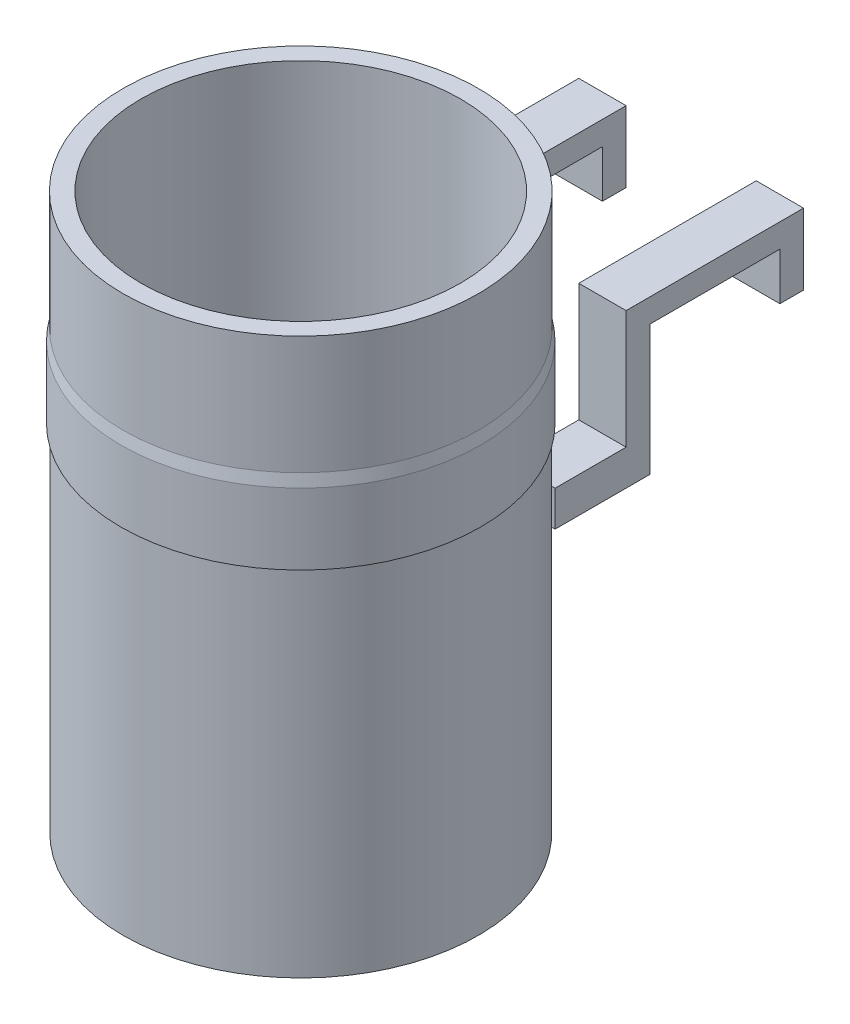
ISO-10303-21;
HEADER;
FILE_DESCRIPTION(('STEP AP214'),'2;1');
FILE_NAME('part.step','',(''),(''),'','','');
FILE_SCHEMA(('AUTOMOTIVE_DESIGN { 1 0 10303 214 1 1 1 1 }'));
ENDSEC;
DATA;
#1=APPLICATION_CONTEXT('core data for automotive mechanical design processes');
#2=APPLICATION_PROTOCOL_DEFINITION('international standard','automotive_design',2000,#1);
#3=PRODUCT_CONTEXT('',#1,'mechanical');
#4=PRODUCT('Part','Part','',(#3));
#5=PRODUCT_RELATED_PRODUCT_CATEGORY('part','',(#4));
#6=PRODUCT_DEFINITION_FORMATION('','',#4);
#7=PRODUCT_DEFINITION_CONTEXT('part definition',#1,'design');
#8=PRODUCT_DEFINITION('design','',#6,#7);
#9=PRODUCT_DEFINITION_SHAPE('','',#8);
#10=(LENGTH_UNIT() NAMED_UNIT(*) SI_UNIT(.MILLI.,.METRE.));
#11=(NAMED_UNIT(*) PLANE_ANGLE_UNIT() SI_UNIT($,.RADIAN.));
#12=(NAMED_UNIT(*) SI_UNIT($,.STERADIAN.) SOLID_ANGLE_UNIT());
#13=UNCERTAINTY_MEASURE_WITH_UNIT(LENGTH_MEASURE(1.E-05),#10,'distance_accuracy_value','');
#14=(GEOMETRIC_REPRESENTATION_CONTEXT(3) GLOBAL_UNCERTAINTY_ASSIGNED_CONTEXT((#13)) GLOBAL_UNIT_ASSIGNED_CONTEXT((#10,
#11,#12)) REPRESENTATION_CONTEXT('',''));
#15=CARTESIAN_POINT('',(0.,0.,0.));
#16=DIRECTION('',(0.,0.,1.));
#17=DIRECTION('',(1.,0.,0.));
#18=AXIS2_PLACEMENT_3D('',#15,#16,#17);
#19=CARTESIAN_POINT('',(-69.8748372027322,160.,-165.));
#20=DIRECTION('',(0.,1.,0.));
#21=DIRECTION('',(0.,0.,1.));
#22=AXIS2_PLACEMENT_3D('',#19,#20,#21);
#23=PLANE('',#22);
#24=DIRECTION('',(-1.,0.,0.));
#25=VECTOR('',#24,1.);
#26=CARTESIAN_POINT('',(-69.8748372027322,160.,-155.));
#27=LINE('',#26,#25);
#28=CARTESIAN_POINT('',(-69.8748372027322,160.,-155.));
#29=VERTEX_POINT('',#28);
#30=CARTESIAN_POINT('',(-89.8748372027322,160.,-155.));
#31=VERTEX_POINT('',#30);
#32=EDGE_CURVE('E214',#29,#31,#27,.T.);
#33=ORIENTED_EDGE('',*,*,#32,.F.);
#34=DIRECTION('',(0.,0.,1.));
#35=VECTOR('',#34,1.);
#36=CARTESIAN_POINT('',(-69.8748372027322,160.,-165.));
#37=LINE('',#36,#35);
#38=CARTESIAN_POINT('',(-69.8748372027323,160.,-100.));
#39=VERTEX_POINT('',#38);
#40=EDGE_CURVE('E57',#29,#39,#37,.T.);
#41=ORIENTED_EDGE('',*,*,#40,.T.);
#42=DIRECTION('',(-1.,0.,0.));
#43=VECTOR('',#42,1.);
#44=CARTESIAN_POINT('',(-69.8748372027322,160.,-100.));
#45=LINE('',#44,#43);
#46=CARTESIAN_POINT('',(-89.8748372027322,160.,-100.));
#47=VERTEX_POINT('',#46);
#48=EDGE_CURVE('E249',#39,#47,#45,.T.);
#49=ORIENTED_EDGE('',*,*,#48,.T.);
#50=DIRECTION('',(0.,0.,1.));
#51=VECTOR('',#50,1.);
#52=CARTESIAN_POINT('',(-89.8748372027322,160.,-165.));
#53=LINE('',#52,#51);
#54=EDGE_CURVE('E261',#31,#47,#53,.T.);
#55=ORIENTED_EDGE('',*,*,#54,.F.);
#56=EDGE_LOOP('',(#33,#41,#49,#55));
#57=FACE_BOUND('',#56,.T.);
#58=ADVANCED_FACE('F41',(#57),#23,.F.);
#59=CARTESIAN_POINT('',(5.1251627972678,160.,-165.));
#60=DIRECTION('',(0.,1.,0.));
#61=DIRECTION('',(0.,0.,1.));
#62=AXIS2_PLACEMENT_3D('',#59,#60,#61);
#63=PLANE('',#62);
#64=DIRECTION('',(-1.,0.,0.));
#65=VECTOR('',#64,1.);
#66=CARTESIAN_POINT('',(5.1251627972678,160.,-155.));
#67=LINE('',#66,#65);
#68=CARTESIAN_POINT('',(5.1251627972678,160.,-155.));
#69=VERTEX_POINT('',#68);
#70=CARTESIAN_POINT('',(-14.8748372027322,160.,-155.));
#71=VERTEX_POINT('',#70);
#72=EDGE_CURVE('E219',#69,#71,#67,.T.);
#73=ORIENTED_EDGE('',*,*,#72,.F.);
#74=DIRECTION('',(0.,0.,1.));
#75=VECTOR('',#74,1.);
#76=CARTESIAN_POINT('',(5.1251627972678,160.,-165.));
#77=LINE('',#76,#75);
#78=CARTESIAN_POINT('',(5.1251627972678,160.,-100.));
#79=VERTEX_POINT('',#78);
#80=EDGE_CURVE('E305',#69,#79,#77,.T.);
#81=ORIENTED_EDGE('',*,*,#80,.T.);
#82=DIRECTION('',(-1.,0.,0.));
#83=VECTOR('',#82,1.);
#84=CARTESIAN_POINT('',(5.1251627972678,160.,-100.));
#85=LINE('',#84,#83);
#86=CARTESIAN_POINT('',(-14.8748372027322,160.,-100.));
#87=VERTEX_POINT('',#86);
#88=EDGE_CURVE('E287',#79,#87,#85,.T.);
#89=ORIENTED_EDGE('',*,*,#88,.T.);
#90=DIRECTION('',(0.,0.,1.));
#91=VECTOR('',#90,1.);
#92=CARTESIAN_POINT('',(-14.8748372027322,160.,-165.));
#93=LINE('',#92,#91);
#94=EDGE_CURVE('E299',#71,#87,#93,.T.);
#95=ORIENTED_EDGE('',*,*,#94,.F.);
#96=EDGE_LOOP('',(#73,#81,#89,#95));
#97=FACE_BOUND('',#96,.T.);
#98=ADVANCED_FACE('F515',(#97),#63,.F.);
#99=CARTESIAN_POINT('',(0.,0.,-100.));
#100=DIRECTION('',(0.,0.,1.));
#101=DIRECTION('',(1.,0.,0.));
#102=AXIS2_PLACEMENT_3D('',#99,#100,#101);
#103=PLANE('',#102);
#104=ORIENTED_EDGE('',*,*,#48,.F.);
#105=DIRECTION('',(0.,1.,0.));
#106=VECTOR('',#105,1.);
#107=CARTESIAN_POINT('',(-69.8748372027323,120.,-100.));
#108=LINE('',#107,#106);
#109=CARTESIAN_POINT('',(-69.8748372027322,105.,-100.));
#110=VERTEX_POINT('',#109);
#111=EDGE_CURVE('E347',#110,#39,#108,.T.);
#112=ORIENTED_EDGE('',*,*,#111,.F.);
#113=DIRECTION('',(1.,0.,0.));
#114=VECTOR('',#113,1.);
#115=CARTESIAN_POINT('',(-89.8748372027323,105.,-100.));
#116=LINE('',#115,#114);
#117=CARTESIAN_POINT('',(-89.8748372027323,105.,-100.));
#118=VERTEX_POINT('',#117);
#119=EDGE_CURVE('E343',#118,#110,#116,.T.);
#120=ORIENTED_EDGE('',*,*,#119,.F.);
#121=DIRECTION('',(0.,-1.,0.));
#122=VECTOR('',#121,1.);
#123=CARTESIAN_POINT('',(-89.8748372027322,120.,-100.));
#124=LINE('',#123,#122);
#125=EDGE_CURVE('E340',#47,#118,#124,.T.);
#126=ORIENTED_EDGE('',*,*,#125,.F.);
#127=EDGE_LOOP('',(#104,#112,#120,#126));
#128=FACE_BOUND('',#127,.T.);
#129=ADVANCED_FACE('F459',(#128),#103,.F.);
#130=CARTESIAN_POINT('',(-89.8748372027322,120.,-100.));
#131=DIRECTION('',(0.,1.,0.));
#132=DIRECTION('',(0.,0.,1.));
#133=AXIS2_PLACEMENT_3D('',#130,#131,#132);
#134=PLANE('',#133);
#135=DIRECTION('',(0.,0.,1.));
#136=VECTOR('',#135,1.);
#137=CARTESIAN_POINT('',(-69.8748372027323,120.,-100.));
#138=LINE('',#137,#136);
#139=CARTESIAN_POINT('',(-69.8748372027323,120.,-90.));
#140=VERTEX_POINT('',#139);
#141=CARTESIAN_POINT('',(-69.8748372027323,120.,-69.7764286847643));
#142=VERTEX_POINT('',#141);
#143=EDGE_CURVE('E355',#140,#142,#138,.T.);
#144=ORIENTED_EDGE('',*,*,#143,.F.);
#145=DIRECTION('',(1.,0.,0.));
#146=VECTOR('',#145,1.);
#147=CARTESIAN_POINT('',(-69.8748372027323,120.,-90.));
#148=LINE('',#147,#146);
#149=CARTESIAN_POINT('',(-89.8748372027322,120.,-90.));
#150=VERTEX_POINT('',#149);
#151=EDGE_CURVE('E65',#150,#140,#148,.T.);
#152=ORIENTED_EDGE('',*,*,#151,.F.);
#153=DIRECTION('',(0.,0.,1.));
#154=VECTOR('',#153,1.);
#155=CARTESIAN_POINT('',(-89.8748372027322,120.,-100.));
#156=LINE('',#155,#154);
#157=CARTESIAN_POINT('',(-89.8748372027322,120.,-60.));
#158=VERTEX_POINT('',#157);
#159=EDGE_CURVE('E351',#150,#158,#156,.T.);
#160=ORIENTED_EDGE('',*,*,#159,.T.);
#161=DIRECTION('',(-1.,0.,0.));
#162=VECTOR('',#161,1.);
#163=CARTESIAN_POINT('',(-89.8748372027322,120.,-60.));
#164=LINE('',#163,#162);
#165=CARTESIAN_POINT('',(-87.3748372027322,120.,-60.));
#166=VERTEX_POINT('',#165);
#167=EDGE_CURVE('E336',#166,#158,#164,.T.);
#168=ORIENTED_EDGE('',*,*,#167,.F.);
#169=CARTESIAN_POINT('',(-42.3748372027322,120.,0.));
#170=DIRECTION('',(0.,1.,0.));
#171=DIRECTION('',(0.,0.,1.));
#172=AXIS2_PLACEMENT_3D('',#169,#170,#171);
#173=CIRCLE('',#172,75.);
#174=EDGE_CURVE('E11',#142,#166,#173,.T.);
#175=ORIENTED_EDGE('',*,*,#174,.F.);
#176=EDGE_LOOP('',(#144,#152,#160,#168,#175));
#177=FACE_BOUND('',#176,.T.);
#178=ADVANCED_FACE('F552',(#177),#134,.T.);
#179=CARTESIAN_POINT('',(0.,0.,-100.));
#180=DIRECTION('',(0.,0.,1.));
#181=DIRECTION('',(1.,0.,0.));
#182=AXIS2_PLACEMENT_3D('',#179,#180,#181);
#183=PLANE('',#182);
#184=ORIENTED_EDGE('',*,*,#88,.F.);
#185=DIRECTION('',(0.,1.,0.));
#186=VECTOR('',#185,1.);
#187=CARTESIAN_POINT('',(5.1251627972678,120.,-100.));
#188=LINE('',#187,#186);
#189=CARTESIAN_POINT('',(5.1251627972678,105.,-100.));
#190=VERTEX_POINT('',#189);
#191=EDGE_CURVE('E380',#190,#79,#188,.T.);
#192=ORIENTED_EDGE('',*,*,#191,.F.);
#193=DIRECTION('',(1.,0.,0.));
#194=VECTOR('',#193,1.);
#195=CARTESIAN_POINT('',(-14.8748372027322,105.,-100.));
#196=LINE('',#195,#194);
#197=CARTESIAN_POINT('',(-14.8748372027322,105.,-100.));
#198=VERTEX_POINT('',#197);
#199=EDGE_CURVE('E376',#198,#190,#196,.T.);
#200=ORIENTED_EDGE('',*,*,#199,.F.);
#201=DIRECTION('',(0.,-1.,0.));
#202=VECTOR('',#201,1.);
#203=CARTESIAN_POINT('',(-14.8748372027322,120.,-100.));
#204=LINE('',#203,#202);
#205=EDGE_CURVE('E373',#87,#198,#204,.T.);
#206=ORIENTED_EDGE('',*,*,#205,.F.);
#207=EDGE_LOOP('',(#184,#192,#200,#206));
#208=FACE_BOUND('',#207,.T.);
#209=ADVANCED_FACE('F555',(#208),#183,.F.);
#210=CARTESIAN_POINT('',(-14.8748372027322,120.,-100.));
#211=DIRECTION('',(0.,1.,0.));
#212=DIRECTION('',(0.,0.,1.));
#213=AXIS2_PLACEMENT_3D('',#210,#211,#212);
#214=PLANE('',#213);
#215=DIRECTION('',(0.,0.,1.));
#216=VECTOR('',#215,1.);
#217=CARTESIAN_POINT('',(5.1251627972678,120.,-100.));
#218=LINE('',#217,#216);
#219=CARTESIAN_POINT('',(5.1251627972678,120.,-90.));
#220=VERTEX_POINT('',#219);
#221=CARTESIAN_POINT('',(5.1251627972678,120.,-60.));
#222=VERTEX_POINT('',#221);
#223=EDGE_CURVE('E389',#220,#222,#218,.T.);
#224=ORIENTED_EDGE('',*,*,#223,.F.);
#225=DIRECTION('',(1.,0.,0.));
#226=VECTOR('',#225,1.);
#227=CARTESIAN_POINT('',(5.1251627972678,120.,-90.));
#228=LINE('',#227,#226);
#229=CARTESIAN_POINT('',(-14.8748372027322,120.,-90.));
#230=VERTEX_POINT('',#229);
#231=EDGE_CURVE('E308',#230,#220,#228,.T.);
#232=ORIENTED_EDGE('',*,*,#231,.F.);
#233=DIRECTION('',(0.,0.,1.));
#234=VECTOR('',#233,1.);
#235=CARTESIAN_POINT('',(-14.8748372027322,120.,-100.));
#236=LINE('',#235,#234);
#237=CARTESIAN_POINT('',(-14.8748372027322,120.,-69.7764286847643));
#238=VERTEX_POINT('',#237);
#239=EDGE_CURVE('E385',#230,#238,#236,.T.);
#240=ORIENTED_EDGE('',*,*,#239,.T.);
#241=CARTESIAN_POINT('',(-42.3748372027322,120.,0.));
#242=DIRECTION('',(0.,1.,0.));
#243=DIRECTION('',(0.,0.,1.));
#244=AXIS2_PLACEMENT_3D('',#241,#242,#243);
#245=CIRCLE('',#244,75.);
#246=CARTESIAN_POINT('',(2.62516279726781,120.,-60.));
#247=VERTEX_POINT('',#246);
#248=EDGE_CURVE('E430',#247,#238,#245,.T.);
#249=ORIENTED_EDGE('',*,*,#248,.F.);
#250=DIRECTION('',(-1.,0.,0.));
#251=VECTOR('',#250,1.);
#252=CARTESIAN_POINT('',(-14.8748372027322,120.,-60.));
#253=LINE('',#252,#251);
#254=EDGE_CURVE('E370',#222,#247,#253,.T.);
#255=ORIENTED_EDGE('',*,*,#254,.F.);
#256=EDGE_LOOP('',(#224,#232,#240,#249,#255));
#257=FACE_BOUND('',#256,.T.);
#258=ADVANCED_FACE('F570',(#257),#214,.T.);
#259=CARTESIAN_POINT('',(-42.3748372027322,150.,0.));
#260=DIRECTION('',(0.,-1.,0.));
#261=DIRECTION('',(0.,0.,-1.));
#262=AXIS2_PLACEMENT_3D('',#259,#260,#261);
#263=CYLINDRICAL_SURFACE('',#262,75.);
#264=DIRECTION('',(0.,-1.,0.));
#265=VECTOR('',#264,1.);
#266=CARTESIAN_POINT('',(-69.8748372027323,150.,-69.7764286847643));
#267=LINE('',#266,#265);
#268=CARTESIAN_POINT('',(-69.8748372027322,105.,-69.7764286847643));
#269=VERTEX_POINT('',#268);
#270=EDGE_CURVE('E50',#269,#142,#267,.F.);
#271=ORIENTED_EDGE('',*,*,#270,.T.);
#272=ORIENTED_EDGE('',*,*,#174,.T.);
#273=DIRECTION('',(0.,-1.,0.));
#274=VECTOR('',#273,1.);
#275=CARTESIAN_POINT('',(-87.3748372027322,150.,-60.));
#276=LINE('',#275,#274);
#277=CARTESIAN_POINT('',(-87.3748372027322,105.,-60.));
#278=VERTEX_POINT('',#277);
#279=EDGE_CURVE('E438',#166,#278,#276,.T.);
#280=ORIENTED_EDGE('',*,*,#279,.T.);
#281=CARTESIAN_POINT('',(-42.3748372027322,105.,0.));
#282=DIRECTION('',(0.,-1.,0.));
#283=DIRECTION('',(0.,0.,-1.));
#284=AXIS2_PLACEMENT_3D('',#281,#282,#283);
#285=CIRCLE('',#284,75.);
#286=EDGE_CURVE('E442',#278,#269,#285,.T.);
#287=ORIENTED_EDGE('',*,*,#286,.T.);
#288=EDGE_LOOP('',(#271,#272,#280,#287));
#289=FACE_BOUND('',#288,.T.);
#290=ORIENTED_EDGE('',*,*,#248,.T.);
#291=DIRECTION('',(0.,-1.,0.));
#292=VECTOR('',#291,1.);
#293=CARTESIAN_POINT('',(-14.8748372027322,150.,-69.7764286847643));
#294=LINE('',#293,#292);
#295=CARTESIAN_POINT('',(-14.8748372027322,105.,-69.7764286847643));
#296=VERTEX_POINT('',#295);
#297=EDGE_CURVE('E434',#238,#296,#294,.T.);
#298=ORIENTED_EDGE('',*,*,#297,.T.);
#299=CARTESIAN_POINT('',(-42.3748372027322,105.,0.));
#300=DIRECTION('',(0.,-1.,0.));
#301=DIRECTION('',(0.,0.,-1.));
#302=AXIS2_PLACEMENT_3D('',#299,#300,#301);
#303=CIRCLE('',#302,75.);
#304=CARTESIAN_POINT('',(2.62516279726781,105.,-60.));
#305=VERTEX_POINT('',#304);
#306=EDGE_CURVE('E426',#296,#305,#303,.T.);
#307=ORIENTED_EDGE('',*,*,#306,.T.);
#308=DIRECTION('',(0.,-1.,0.));
#309=VECTOR('',#308,1.);
#310=CARTESIAN_POINT('',(2.62516279726781,150.,-60.));
#311=LINE('',#310,#309);
#312=EDGE_CURVE('E419',#305,#247,#311,.F.);
#313=ORIENTED_EDGE('',*,*,#312,.T.);
#314=EDGE_LOOP('',(#290,#298,#307,#313));
#315=FACE_BOUND('',#314,.T.);
#316=CARTESIAN_POINT('',(-42.3748372027322,150.,0.));
#317=DIRECTION('',(0.,1.,0.));
#318=DIRECTION('',(0.,0.,1.));
#319=AXIS2_PLACEMENT_3D('',#316,#317,#318);
#320=CIRCLE('',#319,75.);
#321=CARTESIAN_POINT('',(-42.3748372027322,150.,75.));
#322=VERTEX_POINT('',#321);
#323=EDGE_CURVE('E415',#322,#322,#320,.T.);
#324=ORIENTED_EDGE('',*,*,#323,.F.);
#325=EDGE_LOOP('',(#324));
#326=FACE_BOUND('',#325,.T.);
#327=CARTESIAN_POINT('',(-42.3748372027322,0.,0.));
#328=DIRECTION('',(0.,1.,0.));
#329=DIRECTION('',(0.,0.,1.));
#330=AXIS2_PLACEMENT_3D('',#327,#328,#329);
#331=CIRCLE('',#330,75.);
#332=CARTESIAN_POINT('',(-42.3748372027322,0.,75.));
#333=VERTEX_POINT('',#332);
#334=EDGE_CURVE('E411',#333,#333,#331,.T.);
#335=ORIENTED_EDGE('',*,*,#334,.T.);
#336=EDGE_LOOP('',(#335));
#337=FACE_BOUND('',#336,.T.);
#338=ADVANCED_FACE('F43',(#289,#315,#326,#337),#263,.T.);
#339=CARTESIAN_POINT('',(-42.3748372027322,0.,0.));
#340=DIRECTION('',(0.,1.,0.));
#341=DIRECTION('',(0.,0.,1.));
#342=AXIS2_PLACEMENT_3D('',#339,#340,#341);
#343=PLANE('',#342);
#344=ORIENTED_EDGE('',*,*,#334,.F.);
#345=EDGE_LOOP('',(#344));
#346=FACE_BOUND('',#345,.T.);
#347=ADVANCED_FACE('F505',(#346),#343,.F.);
#348=CARTESIAN_POINT('',(-42.3748372027322,180.,0.));
#349=DIRECTION('',(0.,-1.,0.));
#350=DIRECTION('',(0.,0.,-1.));
#351=AXIS2_PLACEMENT_3D('',#348,#349,#350);
#352=CYLINDRICAL_SURFACE('',#351,76.);
#353=CARTESIAN_POINT('',(-42.3748372027322,180.,0.));
#354=DIRECTION('',(0.,1.,0.));
#355=DIRECTION('',(0.,0.,1.));
#356=AXIS2_PLACEMENT_3D('',#353,#354,#355);
#357=CIRCLE('',#356,76.);
#358=CARTESIAN_POINT('',(-42.3748372027322,180.,76.));
#359=VERTEX_POINT('',#358);
#360=EDGE_CURVE('E407',#359,#359,#357,.T.);
#361=ORIENTED_EDGE('',*,*,#360,.F.);
#362=EDGE_LOOP('',(#361));
#363=FACE_BOUND('',#362,.T.);
#364=CARTESIAN_POINT('',(-42.3748372027322,150.,0.));
#365=DIRECTION('',(0.,1.,0.));
#366=DIRECTION('',(0.,0.,1.));
#367=AXIS2_PLACEMENT_3D('',#364,#365,#366);
#368=CIRCLE('',#367,76.);
#369=CARTESIAN_POINT('',(-42.3748372027322,150.,76.));
#370=VERTEX_POINT('',#369);
#371=EDGE_CURVE('E406',#370,#370,#368,.T.);
#372=ORIENTED_EDGE('',*,*,#371,.T.);
#373=EDGE_LOOP('',(#372));
#374=FACE_BOUND('',#373,.T.);
#375=ADVANCED_FACE('F502',(#363,#374),#352,.T.);
#376=CARTESIAN_POINT('',(-42.3748372027322,150.,0.));
#377=DIRECTION('',(0.,1.,0.));
#378=DIRECTION('',(0.,0.,1.));
#379=AXIS2_PLACEMENT_3D('',#376,#377,#378);
#380=PLANE('',#379);
#381=ORIENTED_EDGE('',*,*,#323,.T.);
#382=EDGE_LOOP('',(#381));
#383=FACE_BOUND('',#382,.T.);
#384=ORIENTED_EDGE('',*,*,#371,.F.);
#385=EDGE_LOOP('',(#384));
#386=FACE_BOUND('',#385,.T.);
#387=ADVANCED_FACE('F498',(#383,#386),#380,.F.);
#388=CARTESIAN_POINT('',(-42.3748372027322,180.,0.));
#389=DIRECTION('',(0.,-1.,0.));
#390=DIRECTION('',(0.,0.,1.));
#391=AXIS2_PLACEMENT_3D('',#388,#389,#390);
#392=CONICAL_SURFACE('',#391,76.,0.174532925199433);
#393=CARTESIAN_POINT('',(-42.3748372027322,185.,0.));
#394=DIRECTION('',(0.,1.,0.));
#395=DIRECTION('',(0.,0.,1.));
#396=AXIS2_PLACEMENT_3D('',#393,#394,#395);
#397=CIRCLE('',#396,75.1183650964577);
#398=CARTESIAN_POINT('',(-42.3748372027322,185.,75.1183650964577));
#399=VERTEX_POINT('',#398);
#400=EDGE_CURVE('E402',#399,#399,#397,.T.);
#401=ORIENTED_EDGE('',*,*,#400,.F.);
#402=EDGE_LOOP('',(#401));
#403=FACE_BOUND('',#402,.T.);
#404=ORIENTED_EDGE('',*,*,#360,.T.);
#405=EDGE_LOOP('',(#404));
#406=FACE_BOUND('',#405,.T.);
#407=ADVANCED_FACE('F492',(#403,#406),#392,.T.);
#408=CARTESIAN_POINT('',(-42.3748372027322,235.,0.));
#409=DIRECTION('',(0.,-1.,0.));
#410=DIRECTION('',(0.,0.,-1.));
#411=AXIS2_PLACEMENT_3D('',#408,#409,#410);
#412=CYLINDRICAL_SURFACE('',#411,75.1183650964577);
#413=CARTESIAN_POINT('',(-42.3748372027322,235.,0.));
#414=DIRECTION('',(0.,1.,0.));
#415=DIRECTION('',(0.,0.,1.));
#416=AXIS2_PLACEMENT_3D('',#413,#414,#415);
#417=CIRCLE('',#416,75.1183650964577);
#418=CARTESIAN_POINT('',(-42.3748372027322,235.,75.1183650964577));
#419=VERTEX_POINT('',#418);
#420=EDGE_CURVE('E388',#419,#419,#417,.T.);
#421=ORIENTED_EDGE('',*,*,#420,.F.);
#422=EDGE_LOOP('',(#421));
#423=FACE_BOUND('',#422,.T.);
#424=ORIENTED_EDGE('',*,*,#400,.T.);
#425=EDGE_LOOP('',(#424));
#426=FACE_BOUND('',#425,.T.);
#427=ADVANCED_FACE('F486',(#423,#426),#412,.T.);
#428=CARTESIAN_POINT('',(-42.3748372027322,235.,0.));
#429=DIRECTION('',(0.,1.,0.));
#430=DIRECTION('',(0.,0.,1.));
#431=AXIS2_PLACEMENT_3D('',#428,#429,#430);
#432=PLANE('',#431);
#433=CARTESIAN_POINT('',(-42.3748372027322,235.,0.));
#434=DIRECTION('',(0.,1.,0.));
#435=DIRECTION('',(0.,0.,1.));
#436=AXIS2_PLACEMENT_3D('',#433,#434,#435);
#437=CIRCLE('',#436,67.5);
#438=CARTESIAN_POINT('',(-42.3748372027322,235.,67.5));
#439=VERTEX_POINT('',#438);
#440=EDGE_CURVE('E471',#439,#439,#437,.T.);
#441=ORIENTED_EDGE('',*,*,#440,.F.);
#442=EDGE_LOOP('',(#441));
#443=FACE_BOUND('',#442,.T.);
#444=ORIENTED_EDGE('',*,*,#420,.T.);
#445=EDGE_LOOP('',(#444));
#446=FACE_BOUND('',#445,.T.);
#447=ADVANCED_FACE('F482',(#443,#446),#432,.T.);
#448=CARTESIAN_POINT('',(-14.8748372027322,120.,-100.));
#449=DIRECTION('',(-1.,0.,0.));
#450=DIRECTION('',(0.,0.,1.));
#451=AXIS2_PLACEMENT_3D('',#448,#449,#450);
#452=PLANE('',#451);
#453=ORIENTED_EDGE('',*,*,#297,.F.);
#454=ORIENTED_EDGE('',*,*,#239,.F.);
#455=DIRECTION('',(0.,-1.,0.));
#456=VECTOR('',#455,1.);
#457=CARTESIAN_POINT('',(-14.8748372027322,170.,-90.));
#458=LINE('',#457,#456);
#459=CARTESIAN_POINT('',(-14.8748372027322,170.,-90.));
#460=VERTEX_POINT('',#459);
#461=EDGE_CURVE('E325',#460,#230,#458,.T.);
#462=ORIENTED_EDGE('',*,*,#461,.F.);
#463=DIRECTION('',(0.,0.,1.));
#464=VECTOR('',#463,1.);
#465=CARTESIAN_POINT('',(-14.8748372027322,170.,-100.));
#466=LINE('',#465,#464);
#467=CARTESIAN_POINT('',(-14.8748372027322,170.,-165.));
#468=VERTEX_POINT('',#467);
#469=EDGE_CURVE('E312',#468,#460,#466,.T.);
#470=ORIENTED_EDGE('',*,*,#469,.F.);
#471=DIRECTION('',(0.,1.,0.));
#472=VECTOR('',#471,1.);
#473=CARTESIAN_POINT('',(-14.8748372027322,170.,-165.));
#474=LINE('',#473,#472);
#475=CARTESIAN_POINT('',(-14.8748372027322,140.,-165.));
#476=VERTEX_POINT('',#475);
#477=EDGE_CURVE('E291',#476,#468,#474,.T.);
#478=ORIENTED_EDGE('',*,*,#477,.F.);
#479=DIRECTION('',(0.,0.,-1.));
#480=VECTOR('',#479,1.);
#481=CARTESIAN_POINT('',(-14.8748372027322,140.,-165.));
#482=LINE('',#481,#480);
#483=CARTESIAN_POINT('',(-14.8748372027322,140.,-155.));
#484=VERTEX_POINT('',#483);
#485=EDGE_CURVE('E234',#484,#476,#482,.T.);
#486=ORIENTED_EDGE('',*,*,#485,.F.);
#487=DIRECTION('',(0.,1.,0.));
#488=VECTOR('',#487,1.);
#489=CARTESIAN_POINT('',(-14.8748372027322,140.,-155.));
#490=LINE('',#489,#488);
#491=EDGE_CURVE('E241',#484,#71,#490,.T.);
#492=ORIENTED_EDGE('',*,*,#491,.T.);
#493=ORIENTED_EDGE('',*,*,#94,.T.);
#494=ORIENTED_EDGE('',*,*,#205,.T.);
#495=DIRECTION('',(0.,0.,1.));
#496=VECTOR('',#495,1.);
#497=CARTESIAN_POINT('',(-14.8748372027322,105.,-100.));
#498=LINE('',#497,#496);
#499=EDGE_CURVE('E384',#198,#296,#498,.T.);
#500=ORIENTED_EDGE('',*,*,#499,.T.);
#501=EDGE_LOOP('',(#453,#454,#462,#470,#478,#486,#492,#493,#494,#500));
#502=FACE_BOUND('',#501,.T.);
#503=ADVANCED_FACE('F485',(#502),#452,.T.);
#504=CARTESIAN_POINT('',(0.,0.,-60.));
#505=DIRECTION('',(0.,0.,1.));
#506=DIRECTION('',(1.,0.,0.));
#507=AXIS2_PLACEMENT_3D('',#504,#505,#506);
#508=PLANE('',#507);
#509=ORIENTED_EDGE('',*,*,#312,.F.);
#510=DIRECTION('',(1.,0.,0.));
#511=VECTOR('',#510,1.);
#512=CARTESIAN_POINT('',(-14.8748372027322,105.,-60.));
#513=LINE('',#512,#511);
#514=CARTESIAN_POINT('',(5.1251627972678,105.,-60.));
#515=VERTEX_POINT('',#514);
#516=EDGE_CURVE('E354',#305,#515,#513,.T.);
#517=ORIENTED_EDGE('',*,*,#516,.T.);
#518=DIRECTION('',(0.,1.,0.));
#519=VECTOR('',#518,1.);
#520=CARTESIAN_POINT('',(5.1251627972678,120.,-60.));
#521=LINE('',#520,#519);
#522=EDGE_CURVE('E366',#515,#222,#521,.T.);
#523=ORIENTED_EDGE('',*,*,#522,.T.);
#524=ORIENTED_EDGE('',*,*,#254,.T.);
#525=EDGE_LOOP('',(#509,#517,#523,#524));
#526=FACE_BOUND('',#525,.T.);
#527=ADVANCED_FACE('F563',(#526),#508,.T.);
#528=CARTESIAN_POINT('',(5.1251627972678,120.,-100.));
#529=DIRECTION('',(1.,0.,0.));
#530=DIRECTION('',(0.,1.,0.));
#531=AXIS2_PLACEMENT_3D('',#528,#529,#530);
#532=PLANE('',#531);
#533=ORIENTED_EDGE('',*,*,#191,.T.);
#534=ORIENTED_EDGE('',*,*,#80,.F.);
#535=DIRECTION('',(0.,1.,0.));
#536=VECTOR('',#535,1.);
#537=CARTESIAN_POINT('',(5.1251627972678,140.,-155.));
#538=LINE('',#537,#536);
#539=CARTESIAN_POINT('',(5.1251627972678,140.,-155.));
#540=VERTEX_POINT('',#539);
#541=EDGE_CURVE('E246',#540,#69,#538,.T.);
#542=ORIENTED_EDGE('',*,*,#541,.F.);
#543=DIRECTION('',(0.,0.,1.));
#544=VECTOR('',#543,1.);
#545=CARTESIAN_POINT('',(5.1251627972678,140.,-165.));
#546=LINE('',#545,#544);
#547=CARTESIAN_POINT('',(5.1251627972678,140.,-165.));
#548=VERTEX_POINT('',#547);
#549=EDGE_CURVE('E223',#548,#540,#546,.T.);
#550=ORIENTED_EDGE('',*,*,#549,.F.);
#551=DIRECTION('',(0.,-1.,0.));
#552=VECTOR('',#551,1.);
#553=CARTESIAN_POINT('',(5.1251627972678,170.,-165.));
#554=LINE('',#553,#552);
#555=CARTESIAN_POINT('',(5.1251627972678,170.,-165.));
#556=VERTEX_POINT('',#555);
#557=EDGE_CURVE('E288',#556,#548,#554,.T.);
#558=ORIENTED_EDGE('',*,*,#557,.F.);
#559=DIRECTION('',(0.,0.,-1.));
#560=VECTOR('',#559,1.);
#561=CARTESIAN_POINT('',(5.1251627972678,170.,-100.));
#562=LINE('',#561,#560);
#563=CARTESIAN_POINT('',(5.1251627972678,170.,-90.));
#564=VERTEX_POINT('',#563);
#565=EDGE_CURVE('E309',#564,#556,#562,.T.);
#566=ORIENTED_EDGE('',*,*,#565,.F.);
#567=DIRECTION('',(0.,-1.,0.));
#568=VECTOR('',#567,1.);
#569=CARTESIAN_POINT('',(5.1251627972678,170.,-90.));
#570=LINE('',#569,#568);
#571=EDGE_CURVE('E318',#564,#220,#570,.T.);
#572=ORIENTED_EDGE('',*,*,#571,.T.);
#573=ORIENTED_EDGE('',*,*,#223,.T.);
#574=ORIENTED_EDGE('',*,*,#522,.F.);
#575=DIRECTION('',(0.,0.,1.));
#576=VECTOR('',#575,1.);
#577=CARTESIAN_POINT('',(5.1251627972678,105.,-100.));
#578=LINE('',#577,#576);
#579=EDGE_CURVE('E392',#190,#515,#578,.T.);
#580=ORIENTED_EDGE('',*,*,#579,.F.);
#581=EDGE_LOOP('',(#533,#534,#542,#550,#558,#566,#572,#573,#574,#580));
#582=FACE_BOUND('',#581,.T.);
#583=ADVANCED_FACE('F566',(#582),#532,.T.);
#584=CARTESIAN_POINT('',(-14.8748372027322,105.,-100.));
#585=DIRECTION('',(0.,-1.,0.));
#586=DIRECTION('',(0.,0.,-1.));
#587=AXIS2_PLACEMENT_3D('',#584,#585,#586);
#588=PLANE('',#587);
#589=ORIENTED_EDGE('',*,*,#306,.F.);
#590=ORIENTED_EDGE('',*,*,#499,.F.);
#591=ORIENTED_EDGE('',*,*,#199,.T.);
#592=ORIENTED_EDGE('',*,*,#579,.T.);
#593=ORIENTED_EDGE('',*,*,#516,.F.);
#594=EDGE_LOOP('',(#589,#590,#591,#592,#593));
#595=FACE_BOUND('',#594,.T.);
#596=ADVANCED_FACE('F558',(#595),#588,.T.);
#597=CARTESIAN_POINT('',(-69.8748372027323,120.,-100.));
#598=DIRECTION('',(1.,0.,0.));
#599=DIRECTION('',(0.,1.,0.));
#600=AXIS2_PLACEMENT_3D('',#597,#598,#599);
#601=PLANE('',#600);
#602=ORIENTED_EDGE('',*,*,#270,.F.);
#603=DIRECTION('',(0.,0.,1.));
#604=VECTOR('',#603,1.);
#605=CARTESIAN_POINT('',(-69.8748372027322,105.,-100.));
#606=LINE('',#605,#604);
#607=EDGE_CURVE('E358',#110,#269,#606,.T.);
#608=ORIENTED_EDGE('',*,*,#607,.F.);
#609=ORIENTED_EDGE('',*,*,#111,.T.);
#610=ORIENTED_EDGE('',*,*,#40,.F.);
#611=DIRECTION('',(0.,1.,0.));
#612=VECTOR('',#611,1.);
#613=CARTESIAN_POINT('',(-69.8748372027322,140.,-155.));
#614=LINE('',#613,#612);
#615=CARTESIAN_POINT('',(-69.8748372027322,140.,-155.));
#616=VERTEX_POINT('',#615);
#617=EDGE_CURVE('E196',#616,#29,#614,.T.);
#618=ORIENTED_EDGE('',*,*,#617,.F.);
#619=DIRECTION('',(0.,0.,1.));
#620=VECTOR('',#619,1.);
#621=CARTESIAN_POINT('',(-69.8748372027322,140.,-165.));
#622=LINE('',#621,#620);
#623=CARTESIAN_POINT('',(-69.8748372027322,140.,-165.));
#624=VERTEX_POINT('',#623);
#625=EDGE_CURVE('E204',#624,#616,#622,.T.);
#626=ORIENTED_EDGE('',*,*,#625,.F.);
#627=DIRECTION('',(0.,-1.,0.));
#628=VECTOR('',#627,1.);
#629=CARTESIAN_POINT('',(-69.8748372027323,170.,-165.));
#630=LINE('',#629,#628);
#631=CARTESIAN_POINT('',(-69.8748372027323,170.,-165.));
#632=VERTEX_POINT('',#631);
#633=EDGE_CURVE('E250',#632,#624,#630,.T.);
#634=ORIENTED_EDGE('',*,*,#633,.F.);
#635=DIRECTION('',(0.,0.,-1.));
#636=VECTOR('',#635,1.);
#637=CARTESIAN_POINT('',(-69.8748372027323,170.,-100.));
#638=LINE('',#637,#636);
#639=CARTESIAN_POINT('',(-69.8748372027323,170.,-90.));
#640=VERTEX_POINT('',#639);
#641=EDGE_CURVE('E268',#640,#632,#638,.T.);
#642=ORIENTED_EDGE('',*,*,#641,.F.);
#643=DIRECTION('',(0.,-1.,0.));
#644=VECTOR('',#643,1.);
#645=CARTESIAN_POINT('',(-69.8748372027323,170.,-90.));
#646=LINE('',#645,#644);
#647=EDGE_CURVE('E277',#640,#140,#646,.T.);
#648=ORIENTED_EDGE('',*,*,#647,.T.);
#649=ORIENTED_EDGE('',*,*,#143,.T.);
#650=EDGE_LOOP('',(#602,#608,#609,#610,#618,#626,#634,#642,#648,#649));
#651=FACE_BOUND('',#650,.T.);
#652=ADVANCED_FACE('F216',(#651),#601,.T.);
#653=CARTESIAN_POINT('',(0.,0.,-60.));
#654=DIRECTION('',(0.,0.,1.));
#655=DIRECTION('',(1.,0.,0.));
#656=AXIS2_PLACEMENT_3D('',#653,#654,#655);
#657=PLANE('',#656);
#658=ORIENTED_EDGE('',*,*,#279,.F.);
#659=ORIENTED_EDGE('',*,*,#167,.T.);
#660=DIRECTION('',(0.,-1.,0.));
#661=VECTOR('',#660,1.);
#662=CARTESIAN_POINT('',(-89.8748372027322,120.,-60.));
#663=LINE('',#662,#661);
#664=CARTESIAN_POINT('',(-89.8748372027323,105.,-60.));
#665=VERTEX_POINT('',#664);
#666=EDGE_CURVE('E329',#158,#665,#663,.T.);
#667=ORIENTED_EDGE('',*,*,#666,.T.);
#668=DIRECTION('',(1.,0.,0.));
#669=VECTOR('',#668,1.);
#670=CARTESIAN_POINT('',(-89.8748372027323,105.,-60.));
#671=LINE('',#670,#669);
#672=EDGE_CURVE('E333',#665,#278,#671,.T.);
#673=ORIENTED_EDGE('',*,*,#672,.T.);
#674=EDGE_LOOP('',(#658,#659,#667,#673));
#675=FACE_BOUND('',#674,.T.);
#676=ADVANCED_FACE('F546',(#675),#657,.T.);
#677=CARTESIAN_POINT('',(-89.8748372027322,120.,-100.));
#678=DIRECTION('',(-1.,0.,0.));
#679=DIRECTION('',(0.,-1.,0.));
#680=AXIS2_PLACEMENT_3D('',#677,#678,#679);
#681=PLANE('',#680);
#682=DIRECTION('',(0.,0.,1.));
#683=VECTOR('',#682,1.);
#684=CARTESIAN_POINT('',(-89.8748372027323,105.,-100.));
#685=LINE('',#684,#683);
#686=EDGE_CURVE('E350',#118,#665,#685,.T.);
#687=ORIENTED_EDGE('',*,*,#686,.T.);
#688=ORIENTED_EDGE('',*,*,#666,.F.);
#689=ORIENTED_EDGE('',*,*,#159,.F.);
#690=DIRECTION('',(0.,-1.,0.));
#691=VECTOR('',#690,1.);
#692=CARTESIAN_POINT('',(-89.8748372027322,170.,-90.));
#693=LINE('',#692,#691);
#694=CARTESIAN_POINT('',(-89.8748372027322,170.,-90.));
#695=VERTEX_POINT('',#694);
#696=EDGE_CURVE('E283',#695,#150,#693,.T.);
#697=ORIENTED_EDGE('',*,*,#696,.F.);
#698=DIRECTION('',(0.,0.,1.));
#699=VECTOR('',#698,1.);
#700=CARTESIAN_POINT('',(-89.8748372027322,170.,-100.));
#701=LINE('',#700,#699);
#702=CARTESIAN_POINT('',(-89.8748372027322,170.,-165.));
#703=VERTEX_POINT('',#702);
#704=EDGE_CURVE('E271',#703,#695,#701,.T.);
#705=ORIENTED_EDGE('',*,*,#704,.F.);
#706=DIRECTION('',(0.,1.,0.));
#707=VECTOR('',#706,1.);
#708=CARTESIAN_POINT('',(-89.8748372027322,170.,-165.));
#709=LINE('',#708,#707);
#710=CARTESIAN_POINT('',(-89.8748372027322,140.,-165.));
#711=VERTEX_POINT('',#710);
#712=EDGE_CURVE('E253',#711,#703,#709,.T.);
#713=ORIENTED_EDGE('',*,*,#712,.F.);
#714=DIRECTION('',(0.,0.,-1.));
#715=VECTOR('',#714,1.);
#716=CARTESIAN_POINT('',(-89.8748372027322,140.,-165.));
#717=LINE('',#716,#715);
#718=CARTESIAN_POINT('',(-89.8748372027322,140.,-155.));
#719=VERTEX_POINT('',#718);
#720=EDGE_CURVE('E203',#719,#711,#717,.T.);
#721=ORIENTED_EDGE('',*,*,#720,.F.);
#722=DIRECTION('',(0.,1.,0.));
#723=VECTOR('',#722,1.);
#724=CARTESIAN_POINT('',(-89.8748372027322,140.,-155.));
#725=LINE('',#724,#723);
#726=EDGE_CURVE('E198',#719,#31,#725,.T.);
#727=ORIENTED_EDGE('',*,*,#726,.T.);
#728=ORIENTED_EDGE('',*,*,#54,.T.);
#729=ORIENTED_EDGE('',*,*,#125,.T.);
#730=EDGE_LOOP('',(#687,#688,#689,#697,#705,#713,#721,#727,#728,#729));
#731=FACE_BOUND('',#730,.T.);
#732=ADVANCED_FACE('F462',(#731),#681,.T.);
#733=CARTESIAN_POINT('',(-89.8748372027323,105.,-100.));
#734=DIRECTION('',(0.,-1.,0.));
#735=DIRECTION('',(0.,0.,-1.));
#736=AXIS2_PLACEMENT_3D('',#733,#734,#735);
#737=PLANE('',#736);
#738=ORIENTED_EDGE('',*,*,#286,.F.);
#739=ORIENTED_EDGE('',*,*,#672,.F.);
#740=ORIENTED_EDGE('',*,*,#686,.F.);
#741=ORIENTED_EDGE('',*,*,#119,.T.);
#742=ORIENTED_EDGE('',*,*,#607,.T.);
#743=EDGE_LOOP('',(#738,#739,#740,#741,#742));
#744=FACE_BOUND('',#743,.T.);
#745=ADVANCED_FACE('F453',(#744),#737,.T.);
#746=CARTESIAN_POINT('',(5.1251627972678,170.,-90.));
#747=DIRECTION('',(0.,0.,-1.));
#748=DIRECTION('',(-1.,0.,0.));
#749=AXIS2_PLACEMENT_3D('',#746,#747,#748);
#750=PLANE('',#749);
#751=ORIENTED_EDGE('',*,*,#231,.T.);
#752=ORIENTED_EDGE('',*,*,#571,.F.);
#753=DIRECTION('',(1.,0.,0.));
#754=VECTOR('',#753,1.);
#755=CARTESIAN_POINT('',(5.1251627972678,170.,-90.));
#756=LINE('',#755,#754);
#757=EDGE_CURVE('E315',#460,#564,#756,.T.);
#758=ORIENTED_EDGE('',*,*,#757,.F.);
#759=ORIENTED_EDGE('',*,*,#461,.T.);
#760=EDGE_LOOP('',(#751,#752,#758,#759));
#761=FACE_BOUND('',#760,.T.);
#762=ADVANCED_FACE('F541',(#761),#750,.F.);
#763=CARTESIAN_POINT('',(0.,170.,0.));
#764=DIRECTION('',(0.,-1.,0.));
#765=DIRECTION('',(0.,0.,-1.));
#766=AXIS2_PLACEMENT_3D('',#763,#764,#765);
#767=PLANE('',#766);
#768=ORIENTED_EDGE('',*,*,#565,.T.);
#769=DIRECTION('',(1.,0.,0.));
#770=VECTOR('',#769,1.);
#771=CARTESIAN_POINT('',(5.1251627972678,170.,-165.));
#772=LINE('',#771,#770);
#773=EDGE_CURVE('E295',#468,#556,#772,.T.);
#774=ORIENTED_EDGE('',*,*,#773,.F.);
#775=ORIENTED_EDGE('',*,*,#469,.T.);
#776=ORIENTED_EDGE('',*,*,#757,.T.);
#777=EDGE_LOOP('',(#768,#774,#775,#776));
#778=FACE_BOUND('',#777,.T.);
#779=ADVANCED_FACE('F536',(#778),#767,.F.);
#780=CARTESIAN_POINT('',(0.,0.,-165.));
#781=DIRECTION('',(0.,0.,-1.));
#782=DIRECTION('',(-1.,0.,0.));
#783=AXIS2_PLACEMENT_3D('',#780,#781,#782);
#784=PLANE('',#783);
#785=ORIENTED_EDGE('',*,*,#557,.T.);
#786=DIRECTION('',(1.,0.,0.));
#787=VECTOR('',#786,1.);
#788=CARTESIAN_POINT('',(5.1251627972678,140.,-165.));
#789=LINE('',#788,#787);
#790=EDGE_CURVE('E238',#476,#548,#789,.T.);
#791=ORIENTED_EDGE('',*,*,#790,.F.);
#792=ORIENTED_EDGE('',*,*,#477,.T.);
#793=ORIENTED_EDGE('',*,*,#773,.T.);
#794=EDGE_LOOP('',(#785,#791,#792,#793));
#795=FACE_BOUND('',#794,.T.);
#796=ADVANCED_FACE('F533',(#795),#784,.T.);
#797=CARTESIAN_POINT('',(-69.8748372027323,170.,-90.));
#798=DIRECTION('',(0.,0.,-1.));
#799=DIRECTION('',(-1.,0.,0.));
#800=AXIS2_PLACEMENT_3D('',#797,#798,#799);
#801=PLANE('',#800);
#802=ORIENTED_EDGE('',*,*,#151,.T.);
#803=ORIENTED_EDGE('',*,*,#647,.F.);
#804=DIRECTION('',(1.,0.,0.));
#805=VECTOR('',#804,1.);
#806=CARTESIAN_POINT('',(-69.8748372027323,170.,-90.));
#807=LINE('',#806,#805);
#808=EDGE_CURVE('E274',#695,#640,#807,.T.);
#809=ORIENTED_EDGE('',*,*,#808,.F.);
#810=ORIENTED_EDGE('',*,*,#696,.T.);
#811=EDGE_LOOP('',(#802,#803,#809,#810));
#812=FACE_BOUND('',#811,.T.);
#813=ADVANCED_FACE('F529',(#812),#801,.F.);
#814=CARTESIAN_POINT('',(0.,170.,0.));
#815=DIRECTION('',(0.,-1.,0.));
#816=DIRECTION('',(0.,0.,-1.));
#817=AXIS2_PLACEMENT_3D('',#814,#815,#816);
#818=PLANE('',#817);
#819=ORIENTED_EDGE('',*,*,#641,.T.);
#820=DIRECTION('',(1.,0.,0.));
#821=VECTOR('',#820,1.);
#822=CARTESIAN_POINT('',(-69.8748372027323,170.,-165.));
#823=LINE('',#822,#821);
#824=EDGE_CURVE('E257',#703,#632,#823,.T.);
#825=ORIENTED_EDGE('',*,*,#824,.F.);
#826=ORIENTED_EDGE('',*,*,#704,.T.);
#827=ORIENTED_EDGE('',*,*,#808,.T.);
#828=EDGE_LOOP('',(#819,#825,#826,#827));
#829=FACE_BOUND('',#828,.T.);
#830=ADVANCED_FACE('F526',(#829),#818,.F.);
#831=CARTESIAN_POINT('',(0.,0.,-165.));
#832=DIRECTION('',(0.,0.,-1.));
#833=DIRECTION('',(-1.,0.,0.));
#834=AXIS2_PLACEMENT_3D('',#831,#832,#833);
#835=PLANE('',#834);
#836=ORIENTED_EDGE('',*,*,#633,.T.);
#837=DIRECTION('',(1.,0.,0.));
#838=VECTOR('',#837,1.);
#839=CARTESIAN_POINT('',(-69.8748372027322,140.,-165.));
#840=LINE('',#839,#838);
#841=EDGE_CURVE('E210',#711,#624,#840,.T.);
#842=ORIENTED_EDGE('',*,*,#841,.F.);
#843=ORIENTED_EDGE('',*,*,#712,.T.);
#844=ORIENTED_EDGE('',*,*,#824,.T.);
#845=EDGE_LOOP('',(#836,#842,#843,#844));
#846=FACE_BOUND('',#845,.T.);
#847=ADVANCED_FACE('F524',(#846),#835,.T.);
#848=CARTESIAN_POINT('',(5.1251627972678,140.,-155.));
#849=DIRECTION('',(0.,0.,-1.));
#850=DIRECTION('',(-1.,0.,0.));
#851=AXIS2_PLACEMENT_3D('',#848,#849,#850);
#852=PLANE('',#851);
#853=ORIENTED_EDGE('',*,*,#72,.T.);
#854=ORIENTED_EDGE('',*,*,#491,.F.);
#855=DIRECTION('',(-1.,0.,0.));
#856=VECTOR('',#855,1.);
#857=CARTESIAN_POINT('',(5.1251627972678,140.,-155.));
#858=LINE('',#857,#856);
#859=EDGE_CURVE('E231',#540,#484,#858,.T.);
#860=ORIENTED_EDGE('',*,*,#859,.F.);
#861=ORIENTED_EDGE('',*,*,#541,.T.);
#862=EDGE_LOOP('',(#853,#854,#860,#861));
#863=FACE_BOUND('',#862,.T.);
#864=ADVANCED_FACE('F606',(#863),#852,.F.);
#865=CARTESIAN_POINT('',(0.,140.,0.));
#866=DIRECTION('',(0.,-1.,0.));
#867=DIRECTION('',(0.,0.,-1.));
#868=AXIS2_PLACEMENT_3D('',#865,#866,#867);
#869=PLANE('',#868);
#870=ORIENTED_EDGE('',*,*,#549,.T.);
#871=ORIENTED_EDGE('',*,*,#859,.T.);
#872=ORIENTED_EDGE('',*,*,#485,.T.);
#873=ORIENTED_EDGE('',*,*,#790,.T.);
#874=EDGE_LOOP('',(#870,#871,#872,#873));
#875=FACE_BOUND('',#874,.T.);
#876=ADVANCED_FACE('F602',(#875),#869,.T.);
#877=CARTESIAN_POINT('',(-69.8748372027322,140.,-155.));
#878=DIRECTION('',(0.,0.,-1.));
#879=DIRECTION('',(-1.,0.,0.));
#880=AXIS2_PLACEMENT_3D('',#877,#878,#879);
#881=PLANE('',#880);
#882=ORIENTED_EDGE('',*,*,#32,.T.);
#883=ORIENTED_EDGE('',*,*,#726,.F.);
#884=DIRECTION('',(-1.,0.,0.));
#885=VECTOR('',#884,1.);
#886=CARTESIAN_POINT('',(-69.8748372027322,140.,-155.));
#887=LINE('',#886,#885);
#888=EDGE_CURVE('E192',#616,#719,#887,.T.);
#889=ORIENTED_EDGE('',*,*,#888,.F.);
#890=ORIENTED_EDGE('',*,*,#617,.T.);
#891=EDGE_LOOP('',(#882,#883,#889,#890));
#892=FACE_BOUND('',#891,.T.);
#893=ADVANCED_FACE('F194',(#892),#881,.F.);
#894=CARTESIAN_POINT('',(0.,140.,0.));
#895=DIRECTION('',(0.,-1.,0.));
#896=DIRECTION('',(0.,0.,-1.));
#897=AXIS2_PLACEMENT_3D('',#894,#895,#896);
#898=PLANE('',#897);
#899=ORIENTED_EDGE('',*,*,#625,.T.);
#900=ORIENTED_EDGE('',*,*,#888,.T.);
#901=ORIENTED_EDGE('',*,*,#720,.T.);
#902=ORIENTED_EDGE('',*,*,#841,.T.);
#903=EDGE_LOOP('',(#899,#900,#901,#902));
#904=FACE_BOUND('',#903,.T.);
#905=ADVANCED_FACE('F208',(#904),#898,.T.);
#906=CARTESIAN_POINT('',(-42.3748372027322,35.,0.));
#907=DIRECTION('',(0.,1.,0.));
#908=DIRECTION('',(0.,0.,1.));
#909=AXIS2_PLACEMENT_3D('',#906,#907,#908);
#910=CYLINDRICAL_SURFACE('',#909,67.5);
#911=CARTESIAN_POINT('',(-42.3748372027322,35.,0.));
#912=DIRECTION('',(0.,1.,0.));
#913=DIRECTION('',(0.,0.,1.));
#914=AXIS2_PLACEMENT_3D('',#911,#912,#913);
#915=CIRCLE('',#914,67.5);
#916=CARTESIAN_POINT('',(-42.3748372027322,35.,67.5));
#917=VERTEX_POINT('',#916);
#918=EDGE_CURVE('E468',#917,#917,#915,.T.);
#919=ORIENTED_EDGE('',*,*,#918,.F.);
#920=EDGE_LOOP('',(#919));
#921=FACE_BOUND('',#920,.T.);
#922=ORIENTED_EDGE('',*,*,#440,.T.);
#923=EDGE_LOOP('',(#922));
#924=FACE_BOUND('',#923,.T.);
#925=ADVANCED_FACE('F480',(#921,#924),#910,.F.);
#926=CARTESIAN_POINT('',(-42.3748372027322,35.,0.));
#927=DIRECTION('',(0.,1.,0.));
#928=DIRECTION('',(0.,0.,1.));
#929=AXIS2_PLACEMENT_3D('',#926,#927,#928);
#930=PLANE('',#929);
#931=ORIENTED_EDGE('',*,*,#918,.T.);
#932=EDGE_LOOP('',(#931));
#933=FACE_BOUND('',#932,.T.);
#934=ADVANCED_FACE('F629',(#933),#930,.T.);
#935=CLOSED_SHELL('',(#58,#98,#129,#178,#209,#258,#338,#347,#375,#387,#407,#427,#447,#503,#527,
#583,#596,#652,#676,#732,#745,#762,#779,#796,#813,#830,#847,#864,#876,#893,#905,#925,#934));
#936=MANIFOLD_SOLID_BREP('B2',#935);
#937=ADVANCED_BREP_SHAPE_REPRESENTATION('',(#18,#936),#14);
#938=SHAPE_DEFINITION_REPRESENTATION(#9,#937);
ENDSEC;
END-ISO-10303-21;
